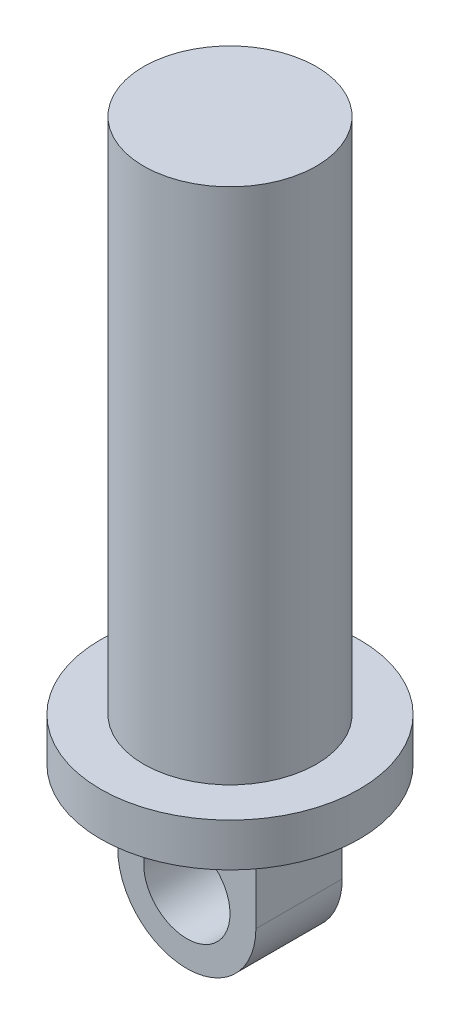
ISO-10303-21;
HEADER;
FILE_DESCRIPTION(('STEP AP214'),'2;1');
FILE_NAME('part.step','',(''),(''),'','','');
FILE_SCHEMA(('AUTOMOTIVE_DESIGN { 1 0 10303 214 1 1 1 1 }'));
ENDSEC;
DATA;
#1=APPLICATION_CONTEXT('core data for automotive mechanical design processes');
#2=APPLICATION_PROTOCOL_DEFINITION('international standard','automotive_design',2000,#1);
#3=PRODUCT_CONTEXT('',#1,'mechanical');
#4=PRODUCT('Part','Part','',(#3));
#5=PRODUCT_RELATED_PRODUCT_CATEGORY('part','',(#4));
#6=PRODUCT_DEFINITION_FORMATION('','',#4);
#7=PRODUCT_DEFINITION_CONTEXT('part definition',#1,'design');
#8=PRODUCT_DEFINITION('design','',#6,#7);
#9=PRODUCT_DEFINITION_SHAPE('','',#8);
#10=(LENGTH_UNIT() NAMED_UNIT(*) SI_UNIT(.MILLI.,.METRE.));
#11=(NAMED_UNIT(*) PLANE_ANGLE_UNIT() SI_UNIT($,.RADIAN.));
#12=(NAMED_UNIT(*) SI_UNIT($,.STERADIAN.) SOLID_ANGLE_UNIT());
#13=UNCERTAINTY_MEASURE_WITH_UNIT(LENGTH_MEASURE(1.E-05),#10,'distance_accuracy_value','');
#14=(GEOMETRIC_REPRESENTATION_CONTEXT(3) GLOBAL_UNCERTAINTY_ASSIGNED_CONTEXT((#13)) GLOBAL_UNIT_ASSIGNED_CONTEXT((#10,
#11,#12)) REPRESENTATION_CONTEXT('',''));
#15=CARTESIAN_POINT('',(0.,0.,0.));
#16=DIRECTION('',(0.,0.,1.));
#17=DIRECTION('',(1.,0.,0.));
#18=AXIS2_PLACEMENT_3D('',#15,#16,#17);
#19=CARTESIAN_POINT('',(-4.,0.,2.5));
#20=DIRECTION('',(-1.,0.,0.));
#21=DIRECTION('',(0.,0.,1.));
#22=AXIS2_PLACEMENT_3D('',#19,#20,#21);
#23=PLANE('',#22);
#24=DIRECTION('',(0.,1.,0.));
#25=VECTOR('',#24,1.);
#26=CARTESIAN_POINT('',(-4.,0.,-2.5));
#27=LINE('',#26,#25);
#28=CARTESIAN_POINT('',(-4.,0.,-2.5));
#29=VERTEX_POINT('',#28);
#30=CARTESIAN_POINT('',(-4.,5.,-2.5));
#31=VERTEX_POINT('',#30);
#32=EDGE_CURVE('E83',#29,#31,#27,.T.);
#33=ORIENTED_EDGE('',*,*,#32,.F.);
#34=DIRECTION('',(0.,0.,-1.));
#35=VECTOR('',#34,1.);
#36=CARTESIAN_POINT('',(-4.,0.,2.5));
#37=LINE('',#36,#35);
#38=CARTESIAN_POINT('',(-4.,0.,2.5));
#39=VERTEX_POINT('',#38);
#40=EDGE_CURVE('E39',#39,#29,#37,.T.);
#41=ORIENTED_EDGE('',*,*,#40,.F.);
#42=DIRECTION('',(0.,1.,0.));
#43=VECTOR('',#42,1.);
#44=CARTESIAN_POINT('',(-4.,0.,2.5));
#45=LINE('',#44,#43);
#46=CARTESIAN_POINT('',(-4.,5.,2.5));
#47=VERTEX_POINT('',#46);
#48=EDGE_CURVE('E53',#39,#47,#45,.T.);
#49=ORIENTED_EDGE('',*,*,#48,.T.);
#50=DIRECTION('',(0.,0.,-1.));
#51=VECTOR('',#50,1.);
#52=CARTESIAN_POINT('',(-4.,5.,2.5));
#53=LINE('',#52,#51);
#54=EDGE_CURVE('E74',#47,#31,#53,.T.);
#55=ORIENTED_EDGE('',*,*,#54,.T.);
#56=EDGE_LOOP('',(#33,#41,#49,#55));
#57=FACE_BOUND('',#56,.T.);
#58=ADVANCED_FACE('F35',(#57),#23,.T.);
#59=CARTESIAN_POINT('',(0.,0.,2.5));
#60=DIRECTION('',(0.,0.,-1.));
#61=DIRECTION('',(-1.,0.,0.));
#62=AXIS2_PLACEMENT_3D('',#59,#60,#61);
#63=CYLINDRICAL_SURFACE('',#62,4.);
#64=CARTESIAN_POINT('',(0.,0.,-2.5));
#65=DIRECTION('',(0.,0.,1.));
#66=DIRECTION('',(1.,0.,0.));
#67=AXIS2_PLACEMENT_3D('',#64,#65,#66);
#68=CIRCLE('',#67,4.);
#69=CARTESIAN_POINT('',(4.,0.,-2.5));
#70=VERTEX_POINT('',#69);
#71=EDGE_CURVE('E96',#29,#70,#68,.T.);
#72=ORIENTED_EDGE('',*,*,#71,.T.);
#73=DIRECTION('',(0.,0.,-1.));
#74=VECTOR('',#73,1.);
#75=CARTESIAN_POINT('',(4.,0.,2.5));
#76=LINE('',#75,#74);
#77=CARTESIAN_POINT('',(4.,0.,2.5));
#78=VERTEX_POINT('',#77);
#79=EDGE_CURVE('E94',#78,#70,#76,.T.);
#80=ORIENTED_EDGE('',*,*,#79,.F.);
#81=CARTESIAN_POINT('',(0.,0.,2.5));
#82=DIRECTION('',(0.,0.,1.));
#83=DIRECTION('',(1.,0.,0.));
#84=AXIS2_PLACEMENT_3D('',#81,#82,#83);
#85=CIRCLE('',#84,4.);
#86=EDGE_CURVE('E113',#39,#78,#85,.T.);
#87=ORIENTED_EDGE('',*,*,#86,.F.);
#88=ORIENTED_EDGE('',*,*,#40,.T.);
#89=EDGE_LOOP('',(#72,#80,#87,#88));
#90=FACE_BOUND('',#89,.T.);
#91=ADVANCED_FACE('F152',(#90),#63,.T.);
#92=CARTESIAN_POINT('',(4.,0.,2.5));
#93=DIRECTION('',(-1.,0.,0.));
#94=DIRECTION('',(0.,0.,1.));
#95=AXIS2_PLACEMENT_3D('',#92,#93,#94);
#96=PLANE('',#95);
#97=DIRECTION('',(0.,1.,0.));
#98=VECTOR('',#97,1.);
#99=CARTESIAN_POINT('',(4.,0.,-2.5));
#100=LINE('',#99,#98);
#101=CARTESIAN_POINT('',(4.,5.,-2.5));
#102=VERTEX_POINT('',#101);
#103=EDGE_CURVE('E69',#70,#102,#100,.T.);
#104=ORIENTED_EDGE('',*,*,#103,.T.);
#105=DIRECTION('',(0.,0.,-1.));
#106=VECTOR('',#105,1.);
#107=CARTESIAN_POINT('',(4.,5.,2.5));
#108=LINE('',#107,#106);
#109=CARTESIAN_POINT('',(4.,5.,2.5));
#110=VERTEX_POINT('',#109);
#111=EDGE_CURVE('E91',#110,#102,#108,.T.);
#112=ORIENTED_EDGE('',*,*,#111,.F.);
#113=DIRECTION('',(0.,1.,0.));
#114=VECTOR('',#113,1.);
#115=CARTESIAN_POINT('',(4.,0.,2.5));
#116=LINE('',#115,#114);
#117=EDGE_CURVE('E111',#78,#110,#116,.T.);
#118=ORIENTED_EDGE('',*,*,#117,.F.);
#119=ORIENTED_EDGE('',*,*,#79,.T.);
#120=EDGE_LOOP('',(#104,#112,#118,#119));
#121=FACE_BOUND('',#120,.T.);
#122=ADVANCED_FACE('F90',(#121),#96,.F.);
#123=CARTESIAN_POINT('',(0.,0.,2.5));
#124=DIRECTION('',(0.,0.,-1.));
#125=DIRECTION('',(-1.,0.,0.));
#126=AXIS2_PLACEMENT_3D('',#123,#124,#125);
#127=CYLINDRICAL_SURFACE('',#126,2.5);
#128=CARTESIAN_POINT('',(0.,0.,2.5));
#129=DIRECTION('',(0.,0.,1.));
#130=DIRECTION('',(1.,0.,0.));
#131=AXIS2_PLACEMENT_3D('',#128,#129,#130);
#132=CIRCLE('',#131,2.5);
#133=CARTESIAN_POINT('',(2.5,0.,2.5));
#134=VERTEX_POINT('',#133);
#135=EDGE_CURVE('E86',#134,#134,#132,.T.);
#136=ORIENTED_EDGE('',*,*,#135,.T.);
#137=EDGE_LOOP('',(#136));
#138=FACE_BOUND('',#137,.T.);
#139=CARTESIAN_POINT('',(0.,0.,-2.5));
#140=DIRECTION('',(0.,0.,1.));
#141=DIRECTION('',(1.,0.,0.));
#142=AXIS2_PLACEMENT_3D('',#139,#140,#141);
#143=CIRCLE('',#142,2.5);
#144=CARTESIAN_POINT('',(2.5,0.,-2.5));
#145=VERTEX_POINT('',#144);
#146=EDGE_CURVE('E106',#145,#145,#143,.T.);
#147=ORIENTED_EDGE('',*,*,#146,.F.);
#148=EDGE_LOOP('',(#147));
#149=FACE_BOUND('',#148,.T.);
#150=ADVANCED_FACE('F37',(#138,#149),#127,.F.);
#151=CARTESIAN_POINT('',(0.,0.,2.5));
#152=DIRECTION('',(0.,0.,1.));
#153=DIRECTION('',(1.,0.,0.));
#154=AXIS2_PLACEMENT_3D('',#151,#152,#153);
#155=PLANE('',#154);
#156=ORIENTED_EDGE('',*,*,#135,.F.);
#157=EDGE_LOOP('',(#156));
#158=FACE_BOUND('',#157,.T.);
#159=ORIENTED_EDGE('',*,*,#48,.F.);
#160=ORIENTED_EDGE('',*,*,#86,.T.);
#161=ORIENTED_EDGE('',*,*,#117,.T.);
#162=DIRECTION('',(1.,0.,0.));
#163=VECTOR('',#162,1.);
#164=CARTESIAN_POINT('',(0.,5.,2.5));
#165=LINE('',#164,#163);
#166=EDGE_CURVE('E100',#47,#110,#165,.T.);
#167=ORIENTED_EDGE('',*,*,#166,.F.);
#168=EDGE_LOOP('',(#159,#160,#161,#167));
#169=FACE_BOUND('',#168,.T.);
#170=ADVANCED_FACE('F163',(#158,#169),#155,.T.);
#171=CARTESIAN_POINT('',(0.,0.,-2.5));
#172=DIRECTION('',(0.,0.,1.));
#173=DIRECTION('',(1.,0.,0.));
#174=AXIS2_PLACEMENT_3D('',#171,#172,#173);
#175=PLANE('',#174);
#176=ORIENTED_EDGE('',*,*,#146,.T.);
#177=EDGE_LOOP('',(#176));
#178=FACE_BOUND('',#177,.T.);
#179=ORIENTED_EDGE('',*,*,#32,.T.);
#180=DIRECTION('',(1.,0.,0.));
#181=VECTOR('',#180,1.);
#182=CARTESIAN_POINT('',(0.,5.,-2.5));
#183=LINE('',#182,#181);
#184=EDGE_CURVE('E81',#31,#102,#183,.T.);
#185=ORIENTED_EDGE('',*,*,#184,.T.);
#186=ORIENTED_EDGE('',*,*,#103,.F.);
#187=ORIENTED_EDGE('',*,*,#71,.F.);
#188=EDGE_LOOP('',(#179,#185,#186,#187));
#189=FACE_BOUND('',#188,.T.);
#190=ADVANCED_FACE('F82',(#178,#189),#175,.F.);
#191=CARTESIAN_POINT('',(0.,7.5,0.));
#192=DIRECTION('',(0.,-1.,0.));
#193=DIRECTION('',(0.,0.,-1.));
#194=AXIS2_PLACEMENT_3D('',#191,#192,#193);
#195=CYLINDRICAL_SURFACE('',#194,7.5);
#196=CARTESIAN_POINT('',(0.,7.5,0.));
#197=DIRECTION('',(0.,1.,0.));
#198=DIRECTION('',(0.,0.,1.));
#199=AXIS2_PLACEMENT_3D('',#196,#197,#198);
#200=CIRCLE('',#199,7.5);
#201=CARTESIAN_POINT('',(0.,7.5,7.5));
#202=VERTEX_POINT('',#201);
#203=EDGE_CURVE('E109',#202,#202,#200,.T.);
#204=ORIENTED_EDGE('',*,*,#203,.F.);
#205=EDGE_LOOP('',(#204));
#206=FACE_BOUND('',#205,.T.);
#207=CARTESIAN_POINT('',(0.,5.,0.));
#208=DIRECTION('',(0.,1.,0.));
#209=DIRECTION('',(0.,0.,1.));
#210=AXIS2_PLACEMENT_3D('',#207,#208,#209);
#211=CIRCLE('',#210,7.5);
#212=CARTESIAN_POINT('',(0.,5.,7.5));
#213=VERTEX_POINT('',#212);
#214=EDGE_CURVE('E119',#213,#213,#211,.T.);
#215=ORIENTED_EDGE('',*,*,#214,.T.);
#216=EDGE_LOOP('',(#215));
#217=FACE_BOUND('',#216,.T.);
#218=ADVANCED_FACE('F139',(#206,#217),#195,.T.);
#219=CARTESIAN_POINT('',(0.,7.5,0.));
#220=DIRECTION('',(0.,1.,0.));
#221=DIRECTION('',(0.,0.,1.));
#222=AXIS2_PLACEMENT_3D('',#219,#220,#221);
#223=PLANE('',#222);
#224=CARTESIAN_POINT('',(0.,7.5,0.));
#225=DIRECTION('',(0.,1.,0.));
#226=DIRECTION('',(0.,0.,1.));
#227=AXIS2_PLACEMENT_3D('',#224,#225,#226);
#228=CIRCLE('',#227,5.);
#229=CARTESIAN_POINT('',(0.,7.5,5.));
#230=VERTEX_POINT('',#229);
#231=EDGE_CURVE('E11',#230,#230,#228,.T.);
#232=ORIENTED_EDGE('',*,*,#231,.F.);
#233=EDGE_LOOP('',(#232));
#234=FACE_BOUND('',#233,.T.);
#235=ORIENTED_EDGE('',*,*,#203,.T.);
#236=EDGE_LOOP('',(#235));
#237=FACE_BOUND('',#236,.T.);
#238=ADVANCED_FACE('F136',(#234,#237),#223,.T.);
#239=CARTESIAN_POINT('',(0.,5.,0.));
#240=DIRECTION('',(0.,1.,0.));
#241=DIRECTION('',(0.,0.,1.));
#242=AXIS2_PLACEMENT_3D('',#239,#240,#241);
#243=PLANE('',#242);
#244=ORIENTED_EDGE('',*,*,#184,.F.);
#245=ORIENTED_EDGE('',*,*,#54,.F.);
#246=ORIENTED_EDGE('',*,*,#166,.T.);
#247=ORIENTED_EDGE('',*,*,#111,.T.);
#248=EDGE_LOOP('',(#244,#245,#246,#247));
#249=FACE_BOUND('',#248,.T.);
#250=ORIENTED_EDGE('',*,*,#214,.F.);
#251=EDGE_LOOP('',(#250));
#252=FACE_BOUND('',#251,.T.);
#253=ADVANCED_FACE('F98',(#249,#252),#243,.F.);
#254=CARTESIAN_POINT('',(0.,37.5,0.));
#255=DIRECTION('',(0.,-1.,0.));
#256=DIRECTION('',(0.,0.,-1.));
#257=AXIS2_PLACEMENT_3D('',#254,#255,#256);
#258=CYLINDRICAL_SURFACE('',#257,5.);
#259=CARTESIAN_POINT('',(0.,37.5,0.));
#260=DIRECTION('',(0.,1.,0.));
#261=DIRECTION('',(0.,0.,1.));
#262=AXIS2_PLACEMENT_3D('',#259,#260,#261);
#263=CIRCLE('',#262,5.);
#264=CARTESIAN_POINT('',(0.,37.5,5.));
#265=VERTEX_POINT('',#264);
#266=EDGE_CURVE('E122',#265,#265,#263,.T.);
#267=ORIENTED_EDGE('',*,*,#266,.F.);
#268=EDGE_LOOP('',(#267));
#269=FACE_BOUND('',#268,.T.);
#270=ORIENTED_EDGE('',*,*,#231,.T.);
#271=EDGE_LOOP('',(#270));
#272=FACE_BOUND('',#271,.T.);
#273=ADVANCED_FACE('F130',(#269,#272),#258,.T.);
#274=CARTESIAN_POINT('',(0.,37.5,0.));
#275=DIRECTION('',(0.,1.,0.));
#276=DIRECTION('',(0.,0.,1.));
#277=AXIS2_PLACEMENT_3D('',#274,#275,#276);
#278=PLANE('',#277);
#279=ORIENTED_EDGE('',*,*,#266,.T.);
#280=EDGE_LOOP('',(#279));
#281=FACE_BOUND('',#280,.T.);
#282=ADVANCED_FACE('F128',(#281),#278,.T.);
#283=CLOSED_SHELL('',(#58,#91,#122,#150,#170,#190,#218,#238,#253,#273,#282));
#284=MANIFOLD_SOLID_BREP('B2',#283);
#285=ADVANCED_BREP_SHAPE_REPRESENTATION('',(#18,#284),#14);
#286=SHAPE_DEFINITION_REPRESENTATION(#9,#285);
ENDSEC;
END-ISO-10303-21;
